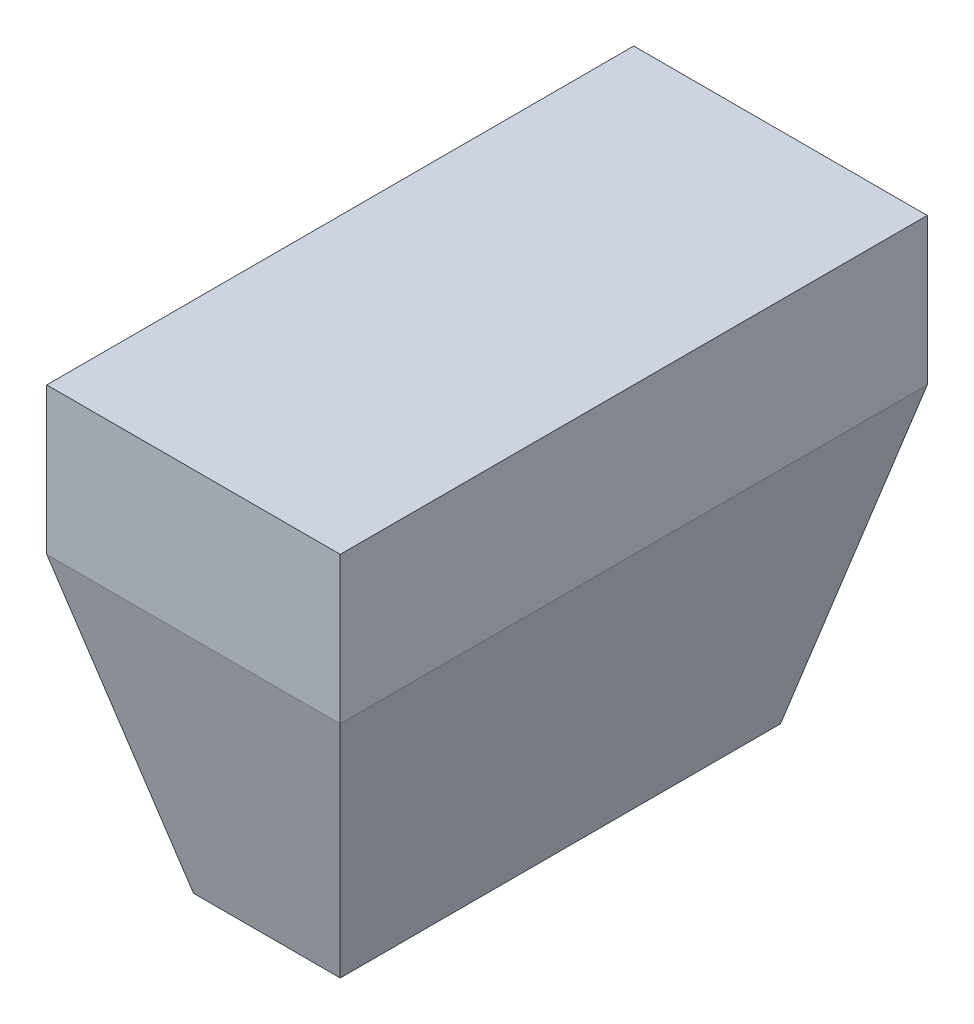
ISO-10303-21;
HEADER;
FILE_DESCRIPTION(('STEP AP214'),'2;1');
FILE_NAME('part.step','',(''),(''),'','','');
FILE_SCHEMA(('AUTOMOTIVE_DESIGN { 1 0 10303 214 1 1 1 1 }'));
ENDSEC;
DATA;
#1=APPLICATION_CONTEXT('core data for automotive mechanical design processes');
#2=APPLICATION_PROTOCOL_DEFINITION('international standard','automotive_design',2000,#1);
#3=PRODUCT_CONTEXT('',#1,'mechanical');
#4=PRODUCT('Part','Part','',(#3));
#5=PRODUCT_RELATED_PRODUCT_CATEGORY('part','',(#4));
#6=PRODUCT_DEFINITION_FORMATION('','',#4);
#7=PRODUCT_DEFINITION_CONTEXT('part definition',#1,'design');
#8=PRODUCT_DEFINITION('design','',#6,#7);
#9=PRODUCT_DEFINITION_SHAPE('','',#8);
#10=(LENGTH_UNIT() NAMED_UNIT(*) SI_UNIT(.MILLI.,.METRE.));
#11=(NAMED_UNIT(*) PLANE_ANGLE_UNIT() SI_UNIT($,.RADIAN.));
#12=(NAMED_UNIT(*) SI_UNIT($,.STERADIAN.) SOLID_ANGLE_UNIT());
#13=UNCERTAINTY_MEASURE_WITH_UNIT(LENGTH_MEASURE(1.E-05),#10,'distance_accuracy_value','');
#14=(GEOMETRIC_REPRESENTATION_CONTEXT(3) GLOBAL_UNCERTAINTY_ASSIGNED_CONTEXT((#13)) GLOBAL_UNIT_ASSIGNED_CONTEXT((#10,
#11,#12)) REPRESENTATION_CONTEXT('',''));
#15=CARTESIAN_POINT('',(0.,0.,0.));
#16=DIRECTION('',(0.,0.,1.));
#17=DIRECTION('',(1.,0.,0.));
#18=AXIS2_PLACEMENT_3D('',#15,#16,#17);
#19=CARTESIAN_POINT('',(-25.4,76.2,-50.8));
#20=DIRECTION('',(1.,0.,0.));
#21=DIRECTION('',(0.,0.,-1.));
#22=AXIS2_PLACEMENT_3D('',#19,#20,#21);
#23=PLANE('',#22);
#24=DIRECTION('',(0.,-1.,0.));
#25=VECTOR('',#24,1.);
#26=CARTESIAN_POINT('',(-25.4,76.2,-50.8));
#27=LINE('',#26,#25);
#28=CARTESIAN_POINT('',(-25.4,76.2,-50.8));
#29=VERTEX_POINT('',#28);
#30=CARTESIAN_POINT('',(-25.4,50.8000000000007,-50.8));
#31=VERTEX_POINT('',#30);
#32=EDGE_CURVE('E138',#29,#31,#27,.T.);
#33=ORIENTED_EDGE('',*,*,#32,.T.);
#34=DIRECTION('',(0.,0.,1.));
#35=VECTOR('',#34,1.);
#36=CARTESIAN_POINT('',(-25.4,50.8000000000007,50.8));
#37=LINE('',#36,#35);
#38=CARTESIAN_POINT('',(-25.4,50.8000000000007,50.8));
#39=VERTEX_POINT('',#38);
#40=EDGE_CURVE('E108',#31,#39,#37,.T.);
#41=ORIENTED_EDGE('',*,*,#40,.T.);
#42=DIRECTION('',(0.,-1.,0.));
#43=VECTOR('',#42,1.);
#44=CARTESIAN_POINT('',(-25.4,76.2,50.8));
#45=LINE('',#44,#43);
#46=CARTESIAN_POINT('',(-25.4,76.2,50.8));
#47=VERTEX_POINT('',#46);
#48=EDGE_CURVE('E90',#47,#39,#45,.T.);
#49=ORIENTED_EDGE('',*,*,#48,.F.);
#50=DIRECTION('',(0.,0.,1.));
#51=VECTOR('',#50,1.);
#52=CARTESIAN_POINT('',(-25.4,76.2,-50.8));
#53=LINE('',#52,#51);
#54=EDGE_CURVE('E97',#29,#47,#53,.T.);
#55=ORIENTED_EDGE('',*,*,#54,.F.);
#56=EDGE_LOOP('',(#33,#41,#49,#55));
#57=FACE_BOUND('',#56,.T.);
#58=ADVANCED_FACE('F33',(#57),#23,.F.);
#59=CARTESIAN_POINT('',(25.4,76.2,50.8));
#60=DIRECTION('',(0.,0.,-1.));
#61=DIRECTION('',(-1.,0.,0.));
#62=AXIS2_PLACEMENT_3D('',#59,#60,#61);
#63=PLANE('',#62);
#64=ORIENTED_EDGE('',*,*,#48,.T.);
#65=DIRECTION('',(1.,0.,0.));
#66=VECTOR('',#65,1.);
#67=CARTESIAN_POINT('',(12.7,50.8000000000007,50.8));
#68=LINE('',#67,#66);
#69=CARTESIAN_POINT('',(25.4,50.8000000000007,50.8));
#70=VERTEX_POINT('',#69);
#71=EDGE_CURVE('E122',#39,#70,#68,.T.);
#72=ORIENTED_EDGE('',*,*,#71,.T.);
#73=DIRECTION('',(0.,-1.,0.));
#74=VECTOR('',#73,1.);
#75=CARTESIAN_POINT('',(25.4,76.2,50.8));
#76=LINE('',#75,#74);
#77=CARTESIAN_POINT('',(25.4,76.2,50.8));
#78=VERTEX_POINT('',#77);
#79=EDGE_CURVE('E93',#78,#70,#76,.T.);
#80=ORIENTED_EDGE('',*,*,#79,.F.);
#81=DIRECTION('',(1.,0.,0.));
#82=VECTOR('',#81,1.);
#83=CARTESIAN_POINT('',(25.4,76.2,50.8));
#84=LINE('',#83,#82);
#85=EDGE_CURVE('E85',#47,#78,#84,.T.);
#86=ORIENTED_EDGE('',*,*,#85,.F.);
#87=EDGE_LOOP('',(#64,#72,#80,#86));
#88=FACE_BOUND('',#87,.T.);
#89=ADVANCED_FACE('F87',(#88),#63,.F.);
#90=CARTESIAN_POINT('',(25.4,76.2,-50.8));
#91=DIRECTION('',(-1.,0.,0.));
#92=DIRECTION('',(0.,0.,1.));
#93=AXIS2_PLACEMENT_3D('',#90,#91,#92);
#94=PLANE('',#93);
#95=ORIENTED_EDGE('',*,*,#79,.T.);
#96=DIRECTION('',(0.,0.,-1.));
#97=VECTOR('',#96,1.);
#98=CARTESIAN_POINT('',(25.4,50.8000000000007,-50.8));
#99=LINE('',#98,#97);
#100=CARTESIAN_POINT('',(25.4,50.8000000000007,-50.8));
#101=VERTEX_POINT('',#100);
#102=EDGE_CURVE('E109',#70,#101,#99,.T.);
#103=ORIENTED_EDGE('',*,*,#102,.T.);
#104=DIRECTION('',(0.,-1.,0.));
#105=VECTOR('',#104,1.);
#106=CARTESIAN_POINT('',(25.4,76.2,-50.8));
#107=LINE('',#106,#105);
#108=CARTESIAN_POINT('',(25.4,76.2,-50.8));
#109=VERTEX_POINT('',#108);
#110=EDGE_CURVE('E114',#109,#101,#107,.T.);
#111=ORIENTED_EDGE('',*,*,#110,.F.);
#112=DIRECTION('',(0.,0.,-1.));
#113=VECTOR('',#112,1.);
#114=CARTESIAN_POINT('',(25.4,76.2,-50.8));
#115=LINE('',#114,#113);
#116=EDGE_CURVE('E96',#78,#109,#115,.T.);
#117=ORIENTED_EDGE('',*,*,#116,.F.);
#118=EDGE_LOOP('',(#95,#103,#111,#117));
#119=FACE_BOUND('',#118,.T.);
#120=ADVANCED_FACE('F150',(#119),#94,.F.);
#121=CARTESIAN_POINT('',(25.4,76.2,-50.8));
#122=DIRECTION('',(0.,0.,1.));
#123=DIRECTION('',(1.,0.,0.));
#124=AXIS2_PLACEMENT_3D('',#121,#122,#123);
#125=PLANE('',#124);
#126=ORIENTED_EDGE('',*,*,#110,.T.);
#127=DIRECTION('',(-1.,0.,0.));
#128=VECTOR('',#127,1.);
#129=CARTESIAN_POINT('',(-12.7,50.8000000000007,-50.8));
#130=LINE('',#129,#128);
#131=EDGE_CURVE('E131',#101,#31,#130,.T.);
#132=ORIENTED_EDGE('',*,*,#131,.T.);
#133=ORIENTED_EDGE('',*,*,#32,.F.);
#134=DIRECTION('',(-1.,0.,0.));
#135=VECTOR('',#134,1.);
#136=CARTESIAN_POINT('',(25.4,76.2,-50.8));
#137=LINE('',#136,#135);
#138=EDGE_CURVE('E102',#109,#29,#137,.T.);
#139=ORIENTED_EDGE('',*,*,#138,.F.);
#140=EDGE_LOOP('',(#126,#132,#133,#139));
#141=FACE_BOUND('',#140,.T.);
#142=ADVANCED_FACE('F137',(#141),#125,.F.);
#143=CARTESIAN_POINT('',(0.,76.2,0.));
#144=DIRECTION('',(0.,-1.,0.));
#145=DIRECTION('',(0.,0.,-1.));
#146=AXIS2_PLACEMENT_3D('',#143,#144,#145);
#147=PLANE('',#146);
#148=ORIENTED_EDGE('',*,*,#54,.T.);
#149=ORIENTED_EDGE('',*,*,#85,.T.);
#150=ORIENTED_EDGE('',*,*,#116,.T.);
#151=ORIENTED_EDGE('',*,*,#138,.T.);
#152=EDGE_LOOP('',(#148,#149,#150,#151));
#153=FACE_BOUND('',#152,.T.);
#154=ADVANCED_FACE('F100',(#153),#147,.F.);
#155=CARTESIAN_POINT('',(0.,0.,0.));
#156=DIRECTION('',(0.,-1.,0.));
#157=DIRECTION('',(0.,0.,-1.));
#158=AXIS2_PLACEMENT_3D('',#155,#156,#157);
#159=PLANE('',#158);
#160=DIRECTION('',(0.,0.,-1.));
#161=VECTOR('',#160,1.);
#162=CARTESIAN_POINT('',(-12.7,0.,-50.8));
#163=LINE('',#162,#161);
#164=CARTESIAN_POINT('',(-12.7,0.,38.1));
#165=VERTEX_POINT('',#164);
#166=CARTESIAN_POINT('',(-12.7,0.,-38.1));
#167=VERTEX_POINT('',#166);
#168=EDGE_CURVE('E120',#165,#167,#163,.T.);
#169=ORIENTED_EDGE('',*,*,#168,.T.);
#170=DIRECTION('',(1.,0.,0.));
#171=VECTOR('',#170,1.);
#172=CARTESIAN_POINT('',(12.7,0.,-38.1));
#173=LINE('',#172,#171);
#174=CARTESIAN_POINT('',(12.7,0.,-38.1));
#175=VERTEX_POINT('',#174);
#176=EDGE_CURVE('E41',#167,#175,#173,.T.);
#177=ORIENTED_EDGE('',*,*,#176,.T.);
#178=DIRECTION('',(0.,0.,1.));
#179=VECTOR('',#178,1.);
#180=CARTESIAN_POINT('',(12.7,0.,50.8));
#181=LINE('',#180,#179);
#182=CARTESIAN_POINT('',(12.7,0.,38.1));
#183=VERTEX_POINT('',#182);
#184=EDGE_CURVE('E112',#175,#183,#181,.T.);
#185=ORIENTED_EDGE('',*,*,#184,.T.);
#186=DIRECTION('',(-1.,0.,0.));
#187=VECTOR('',#186,1.);
#188=CARTESIAN_POINT('',(-12.7,0.,38.1));
#189=LINE('',#188,#187);
#190=EDGE_CURVE('E127',#183,#165,#189,.T.);
#191=ORIENTED_EDGE('',*,*,#190,.T.);
#192=EDGE_LOOP('',(#169,#177,#185,#191));
#193=FACE_BOUND('',#192,.T.);
#194=ADVANCED_FACE('F167',(#193),#159,.T.);
#195=CARTESIAN_POINT('',(25.4,50.8000000000007,-50.8));
#196=DIRECTION('',(0.970142500145333,-0.24253562503633,0.));
#197=DIRECTION('',(0.,0.,1.));
#198=AXIS2_PLACEMENT_3D('',#195,#196,#197);
#199=PLANE('',#198);
#200=ORIENTED_EDGE('',*,*,#184,.F.);
#201=DIRECTION('',(0.235702260395513,0.942809041582065,-0.235702260395513));
#202=VECTOR('',#201,1.);
#203=CARTESIAN_POINT('',(25.4,50.8000000000007,-50.8));
#204=LINE('',#203,#202);
#205=EDGE_CURVE('E11',#175,#101,#204,.T.);
#206=ORIENTED_EDGE('',*,*,#205,.T.);
#207=ORIENTED_EDGE('',*,*,#102,.F.);
#208=DIRECTION('',(-0.235702260395513,-0.942809041582065,-0.235702260395513));
#209=VECTOR('',#208,1.);
#210=CARTESIAN_POINT('',(19.7555555555557,28.2222222222232,45.1555555555557));
#211=LINE('',#210,#209);
#212=EDGE_CURVE('E124',#70,#183,#211,.T.);
#213=ORIENTED_EDGE('',*,*,#212,.T.);
#214=EDGE_LOOP('',(#200,#206,#207,#213));
#215=FACE_BOUND('',#214,.T.);
#216=ADVANCED_FACE('F152',(#215),#199,.T.);
#217=CARTESIAN_POINT('',(-25.4,50.8000000000007,-50.8));
#218=DIRECTION('',(-0.970142500145333,-0.24253562503633,0.));
#219=DIRECTION('',(0.,0.,-1.));
#220=AXIS2_PLACEMENT_3D('',#217,#218,#219);
#221=PLANE('',#220);
#222=ORIENTED_EDGE('',*,*,#40,.F.);
#223=DIRECTION('',(0.235702260395513,-0.942809041582065,0.235702260395513));
#224=VECTOR('',#223,1.);
#225=CARTESIAN_POINT('',(-25.4,50.8000000000007,-50.8));
#226=LINE('',#225,#224);
#227=EDGE_CURVE('E55',#31,#167,#226,.T.);
#228=ORIENTED_EDGE('',*,*,#227,.T.);
#229=ORIENTED_EDGE('',*,*,#168,.F.);
#230=DIRECTION('',(-0.235702260395513,0.942809041582065,0.235702260395513));
#231=VECTOR('',#230,1.);
#232=CARTESIAN_POINT('',(-19.7555555555557,28.2222222222232,45.1555555555557));
#233=LINE('',#232,#231);
#234=EDGE_CURVE('E129',#165,#39,#233,.T.);
#235=ORIENTED_EDGE('',*,*,#234,.T.);
#236=EDGE_LOOP('',(#222,#228,#229,#235));
#237=FACE_BOUND('',#236,.T.);
#238=ADVANCED_FACE('F143',(#237),#221,.T.);
#239=CARTESIAN_POINT('',(25.4,50.8000000000007,50.8));
#240=DIRECTION('',(0.,-0.24253562503633,0.970142500145333));
#241=DIRECTION('',(-1.,0.,0.));
#242=AXIS2_PLACEMENT_3D('',#239,#240,#241);
#243=PLANE('',#242);
#244=ORIENTED_EDGE('',*,*,#234,.F.);
#245=ORIENTED_EDGE('',*,*,#190,.F.);
#246=ORIENTED_EDGE('',*,*,#212,.F.);
#247=ORIENTED_EDGE('',*,*,#71,.F.);
#248=EDGE_LOOP('',(#244,#245,#246,#247));
#249=FACE_BOUND('',#248,.T.);
#250=ADVANCED_FACE('F147',(#249),#243,.T.);
#251=CARTESIAN_POINT('',(25.4,50.8000000000007,-50.8));
#252=DIRECTION('',(0.,-0.24253562503633,-0.970142500145333));
#253=DIRECTION('',(1.,0.,0.));
#254=AXIS2_PLACEMENT_3D('',#251,#252,#253);
#255=PLANE('',#254);
#256=ORIENTED_EDGE('',*,*,#205,.F.);
#257=ORIENTED_EDGE('',*,*,#176,.F.);
#258=ORIENTED_EDGE('',*,*,#227,.F.);
#259=ORIENTED_EDGE('',*,*,#131,.F.);
#260=EDGE_LOOP('',(#256,#257,#258,#259));
#261=FACE_BOUND('',#260,.T.);
#262=ADVANCED_FACE('F35',(#261),#255,.T.);
#263=CLOSED_SHELL('',(#58,#89,#120,#142,#154,#194,#216,#238,#250,#262));
#264=MANIFOLD_SOLID_BREP('B2',#263);
#265=ADVANCED_BREP_SHAPE_REPRESENTATION('',(#18,#264),#14);
#266=SHAPE_DEFINITION_REPRESENTATION(#9,#265);
ENDSEC;
END-ISO-10303-21;
